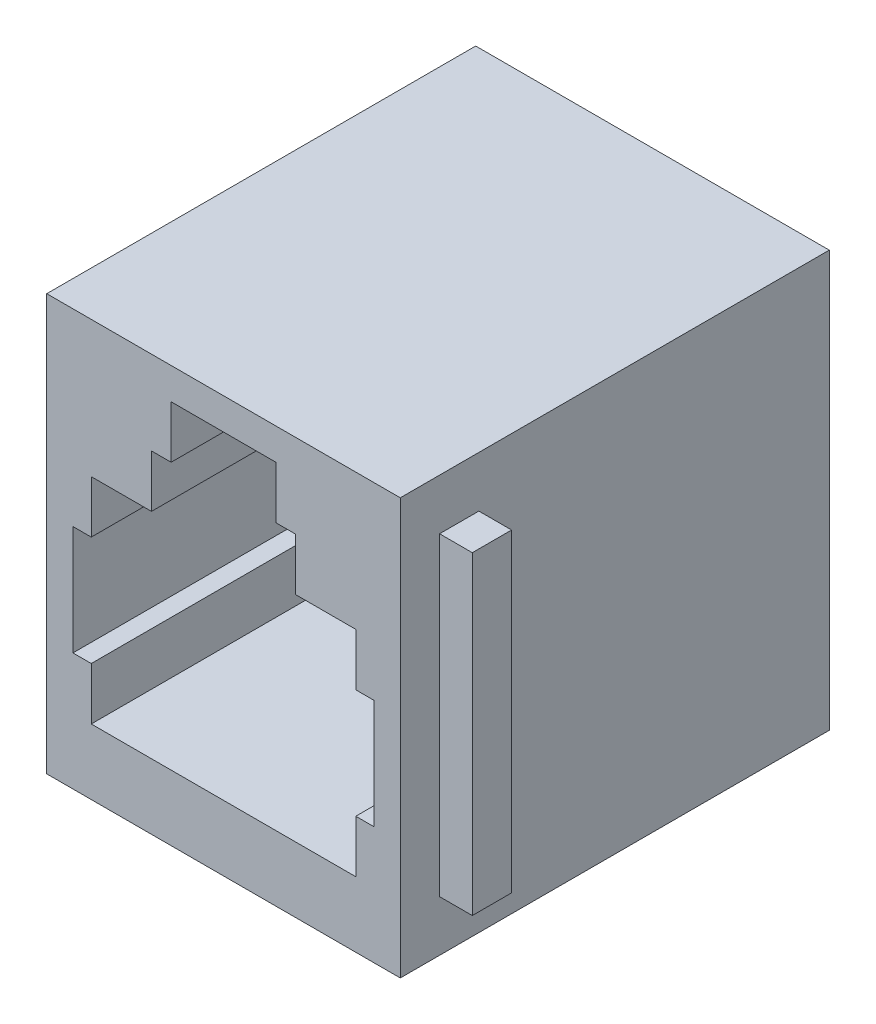
ISO-10303-21;
HEADER;
FILE_DESCRIPTION(('STEP AP214'),'2;1');
FILE_NAME('part.step','',(''),(''),'','','');
FILE_SCHEMA(('AUTOMOTIVE_DESIGN { 1 0 10303 214 1 1 1 1 }'));
ENDSEC;
DATA;
#1=APPLICATION_CONTEXT('core data for automotive mechanical design processes');
#2=APPLICATION_PROTOCOL_DEFINITION('international standard','automotive_design',2000,#1);
#3=PRODUCT_CONTEXT('',#1,'mechanical');
#4=PRODUCT('Part','Part','',(#3));
#5=PRODUCT_RELATED_PRODUCT_CATEGORY('part','',(#4));
#6=PRODUCT_DEFINITION_FORMATION('','',#4);
#7=PRODUCT_DEFINITION_CONTEXT('part definition',#1,'design');
#8=PRODUCT_DEFINITION('design','',#6,#7);
#9=PRODUCT_DEFINITION_SHAPE('','',#8);
#10=(LENGTH_UNIT() NAMED_UNIT(*) SI_UNIT(.MILLI.,.METRE.));
#11=(NAMED_UNIT(*) PLANE_ANGLE_UNIT() SI_UNIT($,.RADIAN.));
#12=(NAMED_UNIT(*) SI_UNIT($,.STERADIAN.) SOLID_ANGLE_UNIT());
#13=UNCERTAINTY_MEASURE_WITH_UNIT(LENGTH_MEASURE(1.E-05),#10,'distance_accuracy_value','');
#14=(GEOMETRIC_REPRESENTATION_CONTEXT(3) GLOBAL_UNCERTAINTY_ASSIGNED_CONTEXT((#13)) GLOBAL_UNIT_ASSIGNED_CONTEXT((#10,
#11,#12)) REPRESENTATION_CONTEXT('',''));
#15=CARTESIAN_POINT('',(0.,0.,0.));
#16=DIRECTION('',(0.,0.,1.));
#17=DIRECTION('',(1.,0.,0.));
#18=AXIS2_PLACEMENT_3D('',#15,#16,#17);
#19=CARTESIAN_POINT('',(-6.75,7.94,16.38));
#20=DIRECTION('',(1.,0.,0.));
#21=DIRECTION('',(0.,1.,0.));
#22=AXIS2_PLACEMENT_3D('',#19,#20,#21);
#23=PLANE('',#22);
#24=DIRECTION('',(0.,-1.,0.));
#25=VECTOR('',#24,1.);
#26=CARTESIAN_POINT('',(-6.75,6.,13.38));
#27=LINE('',#26,#25);
#28=CARTESIAN_POINT('',(-6.75,6.,13.38));
#29=VERTEX_POINT('',#28);
#30=CARTESIAN_POINT('',(-6.75,-6.,13.38));
#31=VERTEX_POINT('',#30);
#32=EDGE_CURVE('E49',#29,#31,#27,.T.);
#33=ORIENTED_EDGE('',*,*,#32,.F.);
#34=DIRECTION('',(0.,0.,-1.));
#35=VECTOR('',#34,1.);
#36=CARTESIAN_POINT('',(-6.75,6.,13.38));
#37=LINE('',#36,#35);
#38=CARTESIAN_POINT('',(-6.75,6.,14.88));
#39=VERTEX_POINT('',#38);
#40=EDGE_CURVE('E53',#39,#29,#37,.T.);
#41=ORIENTED_EDGE('',*,*,#40,.F.);
#42=DIRECTION('',(0.,-1.,0.));
#43=VECTOR('',#42,1.);
#44=CARTESIAN_POINT('',(-6.75,6.,14.88));
#45=LINE('',#44,#43);
#46=CARTESIAN_POINT('',(-6.75,-6.,14.88));
#47=VERTEX_POINT('',#46);
#48=EDGE_CURVE('E266',#39,#47,#45,.T.);
#49=ORIENTED_EDGE('',*,*,#48,.T.);
#50=DIRECTION('',(0.,0.,-1.));
#51=VECTOR('',#50,1.);
#52=CARTESIAN_POINT('',(-6.75,-6.,13.38));
#53=LINE('',#52,#51);
#54=EDGE_CURVE('E257',#47,#31,#53,.T.);
#55=ORIENTED_EDGE('',*,*,#54,.T.);
#56=EDGE_LOOP('',(#33,#41,#49,#55));
#57=FACE_BOUND('',#56,.T.);
#58=DIRECTION('',(0.,-1.,0.));
#59=VECTOR('',#58,1.);
#60=CARTESIAN_POINT('',(-6.75,7.94,0.));
#61=LINE('',#60,#59);
#62=CARTESIAN_POINT('',(-6.75,7.94,0.));
#63=VERTEX_POINT('',#62);
#64=CARTESIAN_POINT('',(-6.75,-7.94,0.));
#65=VERTEX_POINT('',#64);
#66=EDGE_CURVE('E437',#63,#65,#61,.T.);
#67=ORIENTED_EDGE('',*,*,#66,.T.);
#68=DIRECTION('',(0.,0.,-1.));
#69=VECTOR('',#68,1.);
#70=CARTESIAN_POINT('',(-6.75,-7.94,16.38));
#71=LINE('',#70,#69);
#72=CARTESIAN_POINT('',(-6.75,-7.94,16.38));
#73=VERTEX_POINT('',#72);
#74=EDGE_CURVE('E12',#73,#65,#71,.T.);
#75=ORIENTED_EDGE('',*,*,#74,.F.);
#76=DIRECTION('',(0.,-1.,0.));
#77=VECTOR('',#76,1.);
#78=CARTESIAN_POINT('',(-6.75,7.94,16.38));
#79=LINE('',#78,#77);
#80=CARTESIAN_POINT('',(-6.75,7.94,16.38));
#81=VERTEX_POINT('',#80);
#82=EDGE_CURVE('E438',#81,#73,#79,.T.);
#83=ORIENTED_EDGE('',*,*,#82,.F.);
#84=DIRECTION('',(0.,0.,-1.));
#85=VECTOR('',#84,1.);
#86=CARTESIAN_POINT('',(-6.75,7.94,16.38));
#87=LINE('',#86,#85);
#88=EDGE_CURVE('E448',#81,#63,#87,.T.);
#89=ORIENTED_EDGE('',*,*,#88,.T.);
#90=EDGE_LOOP('',(#67,#75,#83,#89));
#91=FACE_BOUND('',#90,.T.);
#92=ADVANCED_FACE('F35',(#57,#91),#23,.F.);
#93=CARTESIAN_POINT('',(-6.75,-7.94,16.38));
#94=DIRECTION('',(0.,1.,0.));
#95=DIRECTION('',(-1.,0.,0.));
#96=AXIS2_PLACEMENT_3D('',#93,#94,#95);
#97=PLANE('',#96);
#98=DIRECTION('',(1.,0.,0.));
#99=VECTOR('',#98,1.);
#100=CARTESIAN_POINT('',(-6.75,-7.94,0.));
#101=LINE('',#100,#99);
#102=CARTESIAN_POINT('',(6.75,-7.94,0.));
#103=VERTEX_POINT('',#102);
#104=EDGE_CURVE('E451',#65,#103,#101,.T.);
#105=ORIENTED_EDGE('',*,*,#104,.T.);
#106=DIRECTION('',(0.,0.,-1.));
#107=VECTOR('',#106,1.);
#108=CARTESIAN_POINT('',(6.75,-7.94,16.38));
#109=LINE('',#108,#107);
#110=CARTESIAN_POINT('',(6.75,-7.94,16.38));
#111=VERTEX_POINT('',#110);
#112=EDGE_CURVE('E42',#111,#103,#109,.T.);
#113=ORIENTED_EDGE('',*,*,#112,.F.);
#114=DIRECTION('',(1.,0.,0.));
#115=VECTOR('',#114,1.);
#116=CARTESIAN_POINT('',(-6.75,-7.94,16.38));
#117=LINE('',#116,#115);
#118=EDGE_CURVE('E441',#73,#111,#117,.T.);
#119=ORIENTED_EDGE('',*,*,#118,.F.);
#120=ORIENTED_EDGE('',*,*,#74,.T.);
#121=EDGE_LOOP('',(#105,#113,#119,#120));
#122=FACE_BOUND('',#121,.T.);
#123=ADVANCED_FACE('F481',(#122),#97,.F.);
#124=CARTESIAN_POINT('',(6.75,7.94,16.38));
#125=DIRECTION('',(-1.,0.,0.));
#126=DIRECTION('',(0.,-1.,0.));
#127=AXIS2_PLACEMENT_3D('',#124,#125,#126);
#128=PLANE('',#127);
#129=DIRECTION('',(0.,-1.,0.));
#130=VECTOR('',#129,1.);
#131=CARTESIAN_POINT('',(6.75,6.,14.88));
#132=LINE('',#131,#130);
#133=CARTESIAN_POINT('',(6.75,6.,14.88));
#134=VERTEX_POINT('',#133);
#135=CARTESIAN_POINT('',(6.75,-6.,14.88));
#136=VERTEX_POINT('',#135);
#137=EDGE_CURVE('E294',#134,#136,#132,.T.);
#138=ORIENTED_EDGE('',*,*,#137,.F.);
#139=DIRECTION('',(0.,0.,1.));
#140=VECTOR('',#139,1.);
#141=CARTESIAN_POINT('',(6.75,6.,13.38));
#142=LINE('',#141,#140);
#143=CARTESIAN_POINT('',(6.75,6.,13.38));
#144=VERTEX_POINT('',#143);
#145=EDGE_CURVE('E270',#144,#134,#142,.T.);
#146=ORIENTED_EDGE('',*,*,#145,.F.);
#147=DIRECTION('',(0.,-1.,0.));
#148=VECTOR('',#147,1.);
#149=CARTESIAN_POINT('',(6.75,6.,13.38));
#150=LINE('',#149,#148);
#151=CARTESIAN_POINT('',(6.75,-6.,13.38));
#152=VERTEX_POINT('',#151);
#153=EDGE_CURVE('E280',#144,#152,#150,.T.);
#154=ORIENTED_EDGE('',*,*,#153,.T.);
#155=DIRECTION('',(0.,0.,1.));
#156=VECTOR('',#155,1.);
#157=CARTESIAN_POINT('',(6.75,-6.,13.38));
#158=LINE('',#157,#156);
#159=EDGE_CURVE('E262',#152,#136,#158,.T.);
#160=ORIENTED_EDGE('',*,*,#159,.T.);
#161=EDGE_LOOP('',(#138,#146,#154,#160));
#162=FACE_BOUND('',#161,.T.);
#163=DIRECTION('',(0.,1.,0.));
#164=VECTOR('',#163,1.);
#165=CARTESIAN_POINT('',(6.75,7.94,0.));
#166=LINE('',#165,#164);
#167=CARTESIAN_POINT('',(6.75,7.94,0.));
#168=VERTEX_POINT('',#167);
#169=EDGE_CURVE('E453',#103,#168,#166,.T.);
#170=ORIENTED_EDGE('',*,*,#169,.T.);
#171=DIRECTION('',(0.,0.,-1.));
#172=VECTOR('',#171,1.);
#173=CARTESIAN_POINT('',(6.75,7.94,16.38));
#174=LINE('',#173,#172);
#175=CARTESIAN_POINT('',(6.75,7.94,16.38));
#176=VERTEX_POINT('',#175);
#177=EDGE_CURVE('E458',#176,#168,#174,.T.);
#178=ORIENTED_EDGE('',*,*,#177,.F.);
#179=DIRECTION('',(0.,1.,0.));
#180=VECTOR('',#179,1.);
#181=CARTESIAN_POINT('',(6.75,7.94,16.38));
#182=LINE('',#181,#180);
#183=EDGE_CURVE('E444',#111,#176,#182,.T.);
#184=ORIENTED_EDGE('',*,*,#183,.F.);
#185=ORIENTED_EDGE('',*,*,#112,.T.);
#186=EDGE_LOOP('',(#170,#178,#184,#185));
#187=FACE_BOUND('',#186,.T.);
#188=ADVANCED_FACE('F465',(#162,#187),#128,.F.);
#189=CARTESIAN_POINT('',(-6.75,7.94,16.38));
#190=DIRECTION('',(0.,-1.,0.));
#191=DIRECTION('',(1.,0.,0.));
#192=AXIS2_PLACEMENT_3D('',#189,#190,#191);
#193=PLANE('',#192);
#194=DIRECTION('',(-1.,0.,0.));
#195=VECTOR('',#194,1.);
#196=CARTESIAN_POINT('',(-6.75,7.94,0.));
#197=LINE('',#196,#195);
#198=EDGE_CURVE('E442',#168,#63,#197,.T.);
#199=ORIENTED_EDGE('',*,*,#198,.T.);
#200=ORIENTED_EDGE('',*,*,#88,.F.);
#201=DIRECTION('',(-1.,0.,0.));
#202=VECTOR('',#201,1.);
#203=CARTESIAN_POINT('',(-6.75,7.94,16.38));
#204=LINE('',#203,#202);
#205=EDGE_CURVE('E446',#176,#81,#204,.T.);
#206=ORIENTED_EDGE('',*,*,#205,.F.);
#207=ORIENTED_EDGE('',*,*,#177,.T.);
#208=EDGE_LOOP('',(#199,#200,#206,#207));
#209=FACE_BOUND('',#208,.T.);
#210=ADVANCED_FACE('F474',(#209),#193,.F.);
#211=CARTESIAN_POINT('',(0.,0.,16.38));
#212=DIRECTION('',(0.,0.,1.));
#213=DIRECTION('',(1.,0.,0.));
#214=AXIS2_PLACEMENT_3D('',#211,#212,#213);
#215=PLANE('',#214);
#216=DIRECTION('',(0.,1.,0.));
#217=VECTOR('',#216,1.);
#218=CARTESIAN_POINT('',(5.05,2.74,16.38));
#219=LINE('',#218,#217);
#220=CARTESIAN_POINT('',(5.05,0.740000000000001,16.38));
#221=VERTEX_POINT('',#220);
#222=CARTESIAN_POINT('',(5.05,2.74,16.38));
#223=VERTEX_POINT('',#222);
#224=EDGE_CURVE('E297',#221,#223,#219,.T.);
#225=ORIENTED_EDGE('',*,*,#224,.F.);
#226=DIRECTION('',(-1.,0.,0.));
#227=VECTOR('',#226,1.);
#228=CARTESIAN_POINT('',(5.05,0.740000000000001,16.38));
#229=LINE('',#228,#227);
#230=CARTESIAN_POINT('',(5.75,0.740000000000001,16.38));
#231=VERTEX_POINT('',#230);
#232=EDGE_CURVE('E393',#231,#221,#229,.T.);
#233=ORIENTED_EDGE('',*,*,#232,.F.);
#234=DIRECTION('',(0.,1.,0.));
#235=VECTOR('',#234,1.);
#236=CARTESIAN_POINT('',(5.75,0.740000000000001,16.38));
#237=LINE('',#236,#235);
#238=CARTESIAN_POINT('',(5.75,-3.44,16.38));
#239=VERTEX_POINT('',#238);
#240=EDGE_CURVE('E390',#239,#231,#237,.T.);
#241=ORIENTED_EDGE('',*,*,#240,.F.);
#242=DIRECTION('',(1.,0.,0.));
#243=VECTOR('',#242,1.);
#244=CARTESIAN_POINT('',(5.75,-3.44,16.38));
#245=LINE('',#244,#243);
#246=CARTESIAN_POINT('',(5.05,-3.44,16.38));
#247=VERTEX_POINT('',#246);
#248=EDGE_CURVE('E387',#247,#239,#245,.T.);
#249=ORIENTED_EDGE('',*,*,#248,.F.);
#250=DIRECTION('',(0.,1.,0.));
#251=VECTOR('',#250,1.);
#252=CARTESIAN_POINT('',(5.05,-3.44,16.38));
#253=LINE('',#252,#251);
#254=CARTESIAN_POINT('',(5.05,-5.44,16.38));
#255=VERTEX_POINT('',#254);
#256=EDGE_CURVE('E384',#255,#247,#253,.T.);
#257=ORIENTED_EDGE('',*,*,#256,.F.);
#258=DIRECTION('',(1.,0.,0.));
#259=VECTOR('',#258,1.);
#260=CARTESIAN_POINT('',(5.05,-5.44,16.38));
#261=LINE('',#260,#259);
#262=CARTESIAN_POINT('',(-5.05,-5.44,16.38));
#263=VERTEX_POINT('',#262);
#264=EDGE_CURVE('E381',#263,#255,#261,.T.);
#265=ORIENTED_EDGE('',*,*,#264,.F.);
#266=DIRECTION('',(0.,-1.,0.));
#267=VECTOR('',#266,1.);
#268=CARTESIAN_POINT('',(-5.05,-3.44,16.38));
#269=LINE('',#268,#267);
#270=CARTESIAN_POINT('',(-5.05,-3.44,16.38));
#271=VERTEX_POINT('',#270);
#272=EDGE_CURVE('E378',#271,#263,#269,.T.);
#273=ORIENTED_EDGE('',*,*,#272,.F.);
#274=DIRECTION('',(1.,0.,0.));
#275=VECTOR('',#274,1.);
#276=CARTESIAN_POINT('',(-5.75,-3.44,16.38));
#277=LINE('',#276,#275);
#278=CARTESIAN_POINT('',(-5.75,-3.44,16.38));
#279=VERTEX_POINT('',#278);
#280=EDGE_CURVE('E375',#279,#271,#277,.T.);
#281=ORIENTED_EDGE('',*,*,#280,.F.);
#282=DIRECTION('',(0.,-1.,0.));
#283=VECTOR('',#282,1.);
#284=CARTESIAN_POINT('',(-5.75,0.740000000000001,16.38));
#285=LINE('',#284,#283);
#286=CARTESIAN_POINT('',(-5.75,0.740000000000001,16.38));
#287=VERTEX_POINT('',#286);
#288=EDGE_CURVE('E372',#287,#279,#285,.T.);
#289=ORIENTED_EDGE('',*,*,#288,.F.);
#290=DIRECTION('',(-1.,0.,0.));
#291=VECTOR('',#290,1.);
#292=CARTESIAN_POINT('',(-5.05,0.740000000000001,16.38));
#293=LINE('',#292,#291);
#294=CARTESIAN_POINT('',(-5.05,0.740000000000001,16.38));
#295=VERTEX_POINT('',#294);
#296=EDGE_CURVE('E369',#295,#287,#293,.T.);
#297=ORIENTED_EDGE('',*,*,#296,.F.);
#298=DIRECTION('',(0.,-1.,0.));
#299=VECTOR('',#298,1.);
#300=CARTESIAN_POINT('',(-5.05,2.74,16.38));
#301=LINE('',#300,#299);
#302=CARTESIAN_POINT('',(-5.05,2.74,16.38));
#303=VERTEX_POINT('',#302);
#304=EDGE_CURVE('E366',#303,#295,#301,.T.);
#305=ORIENTED_EDGE('',*,*,#304,.F.);
#306=DIRECTION('',(-1.,0.,0.));
#307=VECTOR('',#306,1.);
#308=CARTESIAN_POINT('',(-2.75,2.74,16.38));
#309=LINE('',#308,#307);
#310=CARTESIAN_POINT('',(-2.75,2.74,16.38));
#311=VERTEX_POINT('',#310);
#312=EDGE_CURVE('E363',#311,#303,#309,.T.);
#313=ORIENTED_EDGE('',*,*,#312,.F.);
#314=DIRECTION('',(0.,-1.,0.));
#315=VECTOR('',#314,1.);
#316=CARTESIAN_POINT('',(-2.75,4.74,16.38));
#317=LINE('',#316,#315);
#318=CARTESIAN_POINT('',(-2.75,4.74,16.38));
#319=VERTEX_POINT('',#318);
#320=EDGE_CURVE('E360',#319,#311,#317,.T.);
#321=ORIENTED_EDGE('',*,*,#320,.F.);
#322=DIRECTION('',(-1.,0.,0.));
#323=VECTOR('',#322,1.);
#324=CARTESIAN_POINT('',(-2.,4.74,16.38));
#325=LINE('',#324,#323);
#326=CARTESIAN_POINT('',(-2.,4.74,16.38));
#327=VERTEX_POINT('',#326);
#328=EDGE_CURVE('E357',#327,#319,#325,.T.);
#329=ORIENTED_EDGE('',*,*,#328,.F.);
#330=DIRECTION('',(0.,-1.,0.));
#331=VECTOR('',#330,1.);
#332=CARTESIAN_POINT('',(-2.,6.74,16.38));
#333=LINE('',#332,#331);
#334=CARTESIAN_POINT('',(-2.,6.74,16.38));
#335=VERTEX_POINT('',#334);
#336=EDGE_CURVE('E354',#335,#327,#333,.T.);
#337=ORIENTED_EDGE('',*,*,#336,.F.);
#338=DIRECTION('',(-1.,0.,0.));
#339=VECTOR('',#338,1.);
#340=CARTESIAN_POINT('',(-2.,6.74,16.38));
#341=LINE('',#340,#339);
#342=CARTESIAN_POINT('',(2.,6.74,16.38));
#343=VERTEX_POINT('',#342);
#344=EDGE_CURVE('E351',#343,#335,#341,.T.);
#345=ORIENTED_EDGE('',*,*,#344,.F.);
#346=DIRECTION('',(0.,1.,0.));
#347=VECTOR('',#346,1.);
#348=CARTESIAN_POINT('',(2.,6.74,16.38));
#349=LINE('',#348,#347);
#350=CARTESIAN_POINT('',(2.,4.74,16.38));
#351=VERTEX_POINT('',#350);
#352=EDGE_CURVE('E348',#351,#343,#349,.T.);
#353=ORIENTED_EDGE('',*,*,#352,.F.);
#354=DIRECTION('',(-1.,0.,0.));
#355=VECTOR('',#354,1.);
#356=CARTESIAN_POINT('',(2.,4.74,16.38));
#357=LINE('',#356,#355);
#358=CARTESIAN_POINT('',(2.75,4.74,16.38));
#359=VERTEX_POINT('',#358);
#360=EDGE_CURVE('E345',#359,#351,#357,.T.);
#361=ORIENTED_EDGE('',*,*,#360,.F.);
#362=DIRECTION('',(0.,1.,0.));
#363=VECTOR('',#362,1.);
#364=CARTESIAN_POINT('',(2.75,4.74,16.38));
#365=LINE('',#364,#363);
#366=CARTESIAN_POINT('',(2.75,2.74,16.38));
#367=VERTEX_POINT('',#366);
#368=EDGE_CURVE('E342',#367,#359,#365,.T.);
#369=ORIENTED_EDGE('',*,*,#368,.F.);
#370=DIRECTION('',(-1.,0.,0.));
#371=VECTOR('',#370,1.);
#372=CARTESIAN_POINT('',(2.75,2.74,16.38));
#373=LINE('',#372,#371);
#374=EDGE_CURVE('E339',#223,#367,#373,.T.);
#375=ORIENTED_EDGE('',*,*,#374,.F.);
#376=EDGE_LOOP('',(#225,#233,#241,#249,#257,#265,#273,#281,#289,#297,#305,#313,#321,#329,#337,
#345,#353,#361,#369,#375));
#377=FACE_BOUND('',#376,.T.);
#378=ORIENTED_EDGE('',*,*,#82,.T.);
#379=ORIENTED_EDGE('',*,*,#118,.T.);
#380=ORIENTED_EDGE('',*,*,#183,.T.);
#381=ORIENTED_EDGE('',*,*,#205,.T.);
#382=EDGE_LOOP('',(#378,#379,#380,#381));
#383=FACE_BOUND('',#382,.T.);
#384=ADVANCED_FACE('F480',(#377,#383),#215,.T.);
#385=CARTESIAN_POINT('',(0.,0.,0.));
#386=DIRECTION('',(0.,0.,1.));
#387=DIRECTION('',(1.,0.,0.));
#388=AXIS2_PLACEMENT_3D('',#385,#386,#387);
#389=PLANE('',#388);
#390=ORIENTED_EDGE('',*,*,#66,.F.);
#391=ORIENTED_EDGE('',*,*,#198,.F.);
#392=ORIENTED_EDGE('',*,*,#169,.F.);
#393=ORIENTED_EDGE('',*,*,#104,.F.);
#394=EDGE_LOOP('',(#390,#391,#392,#393));
#395=FACE_BOUND('',#394,.T.);
#396=ADVANCED_FACE('F471',(#395),#389,.F.);
#397=CARTESIAN_POINT('',(5.05,2.74,-16.7511910024332));
#398=DIRECTION('',(1.,0.,0.));
#399=DIRECTION('',(0.,0.,-1.));
#400=AXIS2_PLACEMENT_3D('',#397,#398,#399);
#401=PLANE('',#400);
#402=DIRECTION('',(0.,-1.,0.));
#403=VECTOR('',#402,1.);
#404=CARTESIAN_POINT('',(5.05,2.74,1.));
#405=LINE('',#404,#403);
#406=CARTESIAN_POINT('',(5.05,2.74,1.));
#407=VERTEX_POINT('',#406);
#408=CARTESIAN_POINT('',(5.05,0.740000000000001,1.));
#409=VERTEX_POINT('',#408);
#410=EDGE_CURVE('E335',#407,#409,#405,.T.);
#411=ORIENTED_EDGE('',*,*,#410,.T.);
#412=DIRECTION('',(0.,0.,1.));
#413=VECTOR('',#412,1.);
#414=CARTESIAN_POINT('',(5.05,0.740000000000001,-16.7511910024332));
#415=LINE('',#414,#413);
#416=EDGE_CURVE('E301',#409,#221,#415,.T.);
#417=ORIENTED_EDGE('',*,*,#416,.T.);
#418=ORIENTED_EDGE('',*,*,#224,.T.);
#419=DIRECTION('',(0.,0.,1.));
#420=VECTOR('',#419,1.);
#421=CARTESIAN_POINT('',(5.05,2.74,-16.7511910024332));
#422=LINE('',#421,#420);
#423=EDGE_CURVE('E396',#407,#223,#422,.T.);
#424=ORIENTED_EDGE('',*,*,#423,.F.);
#425=EDGE_LOOP('',(#411,#417,#418,#424));
#426=FACE_BOUND('',#425,.T.);
#427=ADVANCED_FACE('F494',(#426),#401,.F.);
#428=CARTESIAN_POINT('',(5.05,0.740000000000001,-16.7511910024332));
#429=DIRECTION('',(0.,1.,0.));
#430=DIRECTION('',(-1.,0.,0.));
#431=AXIS2_PLACEMENT_3D('',#428,#429,#430);
#432=PLANE('',#431);
#433=DIRECTION('',(1.,0.,0.));
#434=VECTOR('',#433,1.);
#435=CARTESIAN_POINT('',(5.05,0.740000000000001,1.));
#436=LINE('',#435,#434);
#437=CARTESIAN_POINT('',(5.75,0.740000000000001,1.));
#438=VERTEX_POINT('',#437);
#439=EDGE_CURVE('E333',#409,#438,#436,.T.);
#440=ORIENTED_EDGE('',*,*,#439,.T.);
#441=DIRECTION('',(0.,0.,1.));
#442=VECTOR('',#441,1.);
#443=CARTESIAN_POINT('',(5.75,0.740000000000001,-16.7511910024332));
#444=LINE('',#443,#442);
#445=EDGE_CURVE('E398',#438,#231,#444,.T.);
#446=ORIENTED_EDGE('',*,*,#445,.T.);
#447=ORIENTED_EDGE('',*,*,#232,.T.);
#448=ORIENTED_EDGE('',*,*,#416,.F.);
#449=EDGE_LOOP('',(#440,#446,#447,#448));
#450=FACE_BOUND('',#449,.T.);
#451=ADVANCED_FACE('F500',(#450),#432,.F.);
#452=CARTESIAN_POINT('',(5.75,0.740000000000001,-16.7511910024332));
#453=DIRECTION('',(1.,0.,0.));
#454=DIRECTION('',(0.,1.,0.));
#455=AXIS2_PLACEMENT_3D('',#452,#453,#454);
#456=PLANE('',#455);
#457=DIRECTION('',(0.,-1.,0.));
#458=VECTOR('',#457,1.);
#459=CARTESIAN_POINT('',(5.75,0.740000000000001,1.));
#460=LINE('',#459,#458);
#461=CARTESIAN_POINT('',(5.75,-3.44,1.));
#462=VERTEX_POINT('',#461);
#463=EDGE_CURVE('E331',#438,#462,#460,.T.);
#464=ORIENTED_EDGE('',*,*,#463,.T.);
#465=DIRECTION('',(0.,0.,1.));
#466=VECTOR('',#465,1.);
#467=CARTESIAN_POINT('',(5.75,-3.44,-16.7511910024332));
#468=LINE('',#467,#466);
#469=EDGE_CURVE('E400',#462,#239,#468,.T.);
#470=ORIENTED_EDGE('',*,*,#469,.T.);
#471=ORIENTED_EDGE('',*,*,#240,.T.);
#472=ORIENTED_EDGE('',*,*,#445,.F.);
#473=EDGE_LOOP('',(#464,#470,#471,#472));
#474=FACE_BOUND('',#473,.T.);
#475=ADVANCED_FACE('F570',(#474),#456,.F.);
#476=CARTESIAN_POINT('',(5.75,-3.44,-16.7511910024332));
#477=DIRECTION('',(0.,-1.,0.));
#478=DIRECTION('',(0.,0.,-1.));
#479=AXIS2_PLACEMENT_3D('',#476,#477,#478);
#480=PLANE('',#479);
#481=DIRECTION('',(-1.,0.,0.));
#482=VECTOR('',#481,1.);
#483=CARTESIAN_POINT('',(5.75,-3.44,1.));
#484=LINE('',#483,#482);
#485=CARTESIAN_POINT('',(5.05,-3.44,1.));
#486=VERTEX_POINT('',#485);
#487=EDGE_CURVE('E329',#462,#486,#484,.T.);
#488=ORIENTED_EDGE('',*,*,#487,.T.);
#489=DIRECTION('',(0.,0.,1.));
#490=VECTOR('',#489,1.);
#491=CARTESIAN_POINT('',(5.05,-3.44,-16.7511910024332));
#492=LINE('',#491,#490);
#493=EDGE_CURVE('E402',#486,#247,#492,.T.);
#494=ORIENTED_EDGE('',*,*,#493,.T.);
#495=ORIENTED_EDGE('',*,*,#248,.T.);
#496=ORIENTED_EDGE('',*,*,#469,.F.);
#497=EDGE_LOOP('',(#488,#494,#495,#496));
#498=FACE_BOUND('',#497,.T.);
#499=ADVANCED_FACE('F566',(#498),#480,.F.);
#500=CARTESIAN_POINT('',(5.05,-3.44,-16.7511910024332));
#501=DIRECTION('',(1.,0.,0.));
#502=DIRECTION('',(0.,0.,-1.));
#503=AXIS2_PLACEMENT_3D('',#500,#501,#502);
#504=PLANE('',#503);
#505=DIRECTION('',(0.,-1.,0.));
#506=VECTOR('',#505,1.);
#507=CARTESIAN_POINT('',(5.05,-3.44,1.));
#508=LINE('',#507,#506);
#509=CARTESIAN_POINT('',(5.05,-5.44,1.));
#510=VERTEX_POINT('',#509);
#511=EDGE_CURVE('E327',#486,#510,#508,.T.);
#512=ORIENTED_EDGE('',*,*,#511,.T.);
#513=DIRECTION('',(0.,0.,1.));
#514=VECTOR('',#513,1.);
#515=CARTESIAN_POINT('',(5.05,-5.44,-16.7511910024332));
#516=LINE('',#515,#514);
#517=EDGE_CURVE('E404',#510,#255,#516,.T.);
#518=ORIENTED_EDGE('',*,*,#517,.T.);
#519=ORIENTED_EDGE('',*,*,#256,.T.);
#520=ORIENTED_EDGE('',*,*,#493,.F.);
#521=EDGE_LOOP('',(#512,#518,#519,#520));
#522=FACE_BOUND('',#521,.T.);
#523=ADVANCED_FACE('F562',(#522),#504,.F.);
#524=CARTESIAN_POINT('',(5.05,-5.44,-16.7511910024332));
#525=DIRECTION('',(0.,-1.,0.));
#526=DIRECTION('',(0.,0.,-1.));
#527=AXIS2_PLACEMENT_3D('',#524,#525,#526);
#528=PLANE('',#527);
#529=DIRECTION('',(-1.,0.,0.));
#530=VECTOR('',#529,1.);
#531=CARTESIAN_POINT('',(5.05,-5.44,1.));
#532=LINE('',#531,#530);
#533=CARTESIAN_POINT('',(-5.05,-5.44,1.));
#534=VERTEX_POINT('',#533);
#535=EDGE_CURVE('E325',#510,#534,#532,.T.);
#536=ORIENTED_EDGE('',*,*,#535,.T.);
#537=DIRECTION('',(0.,0.,1.));
#538=VECTOR('',#537,1.);
#539=CARTESIAN_POINT('',(-5.05,-5.44,-16.7511910024332));
#540=LINE('',#539,#538);
#541=EDGE_CURVE('E406',#534,#263,#540,.T.);
#542=ORIENTED_EDGE('',*,*,#541,.T.);
#543=ORIENTED_EDGE('',*,*,#264,.T.);
#544=ORIENTED_EDGE('',*,*,#517,.F.);
#545=EDGE_LOOP('',(#536,#542,#543,#544));
#546=FACE_BOUND('',#545,.T.);
#547=ADVANCED_FACE('F558',(#546),#528,.F.);
#548=CARTESIAN_POINT('',(-5.05,-3.44,-16.7511910024332));
#549=DIRECTION('',(-1.,0.,0.));
#550=DIRECTION('',(0.,0.,1.));
#551=AXIS2_PLACEMENT_3D('',#548,#549,#550);
#552=PLANE('',#551);
#553=DIRECTION('',(0.,1.,0.));
#554=VECTOR('',#553,1.);
#555=CARTESIAN_POINT('',(-5.05,-3.44,1.));
#556=LINE('',#555,#554);
#557=CARTESIAN_POINT('',(-5.05,-3.44,1.));
#558=VERTEX_POINT('',#557);
#559=EDGE_CURVE('E323',#534,#558,#556,.T.);
#560=ORIENTED_EDGE('',*,*,#559,.T.);
#561=DIRECTION('',(0.,0.,1.));
#562=VECTOR('',#561,1.);
#563=CARTESIAN_POINT('',(-5.05,-3.44,-16.7511910024332));
#564=LINE('',#563,#562);
#565=EDGE_CURVE('E408',#558,#271,#564,.T.);
#566=ORIENTED_EDGE('',*,*,#565,.T.);
#567=ORIENTED_EDGE('',*,*,#272,.T.);
#568=ORIENTED_EDGE('',*,*,#541,.F.);
#569=EDGE_LOOP('',(#560,#566,#567,#568));
#570=FACE_BOUND('',#569,.T.);
#571=ADVANCED_FACE('F554',(#570),#552,.F.);
#572=CARTESIAN_POINT('',(-5.75,-3.44,-16.7511910024332));
#573=DIRECTION('',(0.,-1.,0.));
#574=DIRECTION('',(0.,0.,-1.));
#575=AXIS2_PLACEMENT_3D('',#572,#573,#574);
#576=PLANE('',#575);
#577=DIRECTION('',(-1.,0.,0.));
#578=VECTOR('',#577,1.);
#579=CARTESIAN_POINT('',(-5.75,-3.44,1.));
#580=LINE('',#579,#578);
#581=CARTESIAN_POINT('',(-5.75,-3.44,1.));
#582=VERTEX_POINT('',#581);
#583=EDGE_CURVE('E321',#558,#582,#580,.T.);
#584=ORIENTED_EDGE('',*,*,#583,.T.);
#585=DIRECTION('',(0.,0.,1.));
#586=VECTOR('',#585,1.);
#587=CARTESIAN_POINT('',(-5.75,-3.44,-16.7511910024332));
#588=LINE('',#587,#586);
#589=EDGE_CURVE('E410',#582,#279,#588,.T.);
#590=ORIENTED_EDGE('',*,*,#589,.T.);
#591=ORIENTED_EDGE('',*,*,#280,.T.);
#592=ORIENTED_EDGE('',*,*,#565,.F.);
#593=EDGE_LOOP('',(#584,#590,#591,#592));
#594=FACE_BOUND('',#593,.T.);
#595=ADVANCED_FACE('F550',(#594),#576,.F.);
#596=CARTESIAN_POINT('',(-5.75,0.740000000000001,-16.7511910024332));
#597=DIRECTION('',(-1.,0.,0.));
#598=DIRECTION('',(0.,-1.,0.));
#599=AXIS2_PLACEMENT_3D('',#596,#597,#598);
#600=PLANE('',#599);
#601=DIRECTION('',(0.,1.,0.));
#602=VECTOR('',#601,1.);
#603=CARTESIAN_POINT('',(-5.75,0.740000000000001,1.));
#604=LINE('',#603,#602);
#605=CARTESIAN_POINT('',(-5.75,0.740000000000001,1.));
#606=VERTEX_POINT('',#605);
#607=EDGE_CURVE('E319',#582,#606,#604,.T.);
#608=ORIENTED_EDGE('',*,*,#607,.T.);
#609=DIRECTION('',(0.,0.,1.));
#610=VECTOR('',#609,1.);
#611=CARTESIAN_POINT('',(-5.75,0.740000000000001,-16.7511910024332));
#612=LINE('',#611,#610);
#613=EDGE_CURVE('E412',#606,#287,#612,.T.);
#614=ORIENTED_EDGE('',*,*,#613,.T.);
#615=ORIENTED_EDGE('',*,*,#288,.T.);
#616=ORIENTED_EDGE('',*,*,#589,.F.);
#617=EDGE_LOOP('',(#608,#614,#615,#616));
#618=FACE_BOUND('',#617,.T.);
#619=ADVANCED_FACE('F546',(#618),#600,.F.);
#620=CARTESIAN_POINT('',(-5.05,0.740000000000001,-16.7511910024332));
#621=DIRECTION('',(0.,1.,0.));
#622=DIRECTION('',(-1.,0.,0.));
#623=AXIS2_PLACEMENT_3D('',#620,#621,#622);
#624=PLANE('',#623);
#625=DIRECTION('',(1.,0.,0.));
#626=VECTOR('',#625,1.);
#627=CARTESIAN_POINT('',(-5.05,0.740000000000001,1.));
#628=LINE('',#627,#626);
#629=CARTESIAN_POINT('',(-5.05,0.740000000000001,1.));
#630=VERTEX_POINT('',#629);
#631=EDGE_CURVE('E317',#606,#630,#628,.T.);
#632=ORIENTED_EDGE('',*,*,#631,.T.);
#633=DIRECTION('',(0.,0.,1.));
#634=VECTOR('',#633,1.);
#635=CARTESIAN_POINT('',(-5.05,0.740000000000001,-16.7511910024332));
#636=LINE('',#635,#634);
#637=EDGE_CURVE('E414',#630,#295,#636,.T.);
#638=ORIENTED_EDGE('',*,*,#637,.T.);
#639=ORIENTED_EDGE('',*,*,#296,.T.);
#640=ORIENTED_EDGE('',*,*,#613,.F.);
#641=EDGE_LOOP('',(#632,#638,#639,#640));
#642=FACE_BOUND('',#641,.T.);
#643=ADVANCED_FACE('F542',(#642),#624,.F.);
#644=CARTESIAN_POINT('',(-5.05,2.74,-16.7511910024332));
#645=DIRECTION('',(-1.,0.,0.));
#646=DIRECTION('',(0.,0.,1.));
#647=AXIS2_PLACEMENT_3D('',#644,#645,#646);
#648=PLANE('',#647);
#649=DIRECTION('',(0.,1.,0.));
#650=VECTOR('',#649,1.);
#651=CARTESIAN_POINT('',(-5.05,2.74,1.));
#652=LINE('',#651,#650);
#653=CARTESIAN_POINT('',(-5.05,2.74,1.));
#654=VERTEX_POINT('',#653);
#655=EDGE_CURVE('E315',#630,#654,#652,.T.);
#656=ORIENTED_EDGE('',*,*,#655,.T.);
#657=DIRECTION('',(0.,0.,1.));
#658=VECTOR('',#657,1.);
#659=CARTESIAN_POINT('',(-5.05,2.74,-16.7511910024332));
#660=LINE('',#659,#658);
#661=EDGE_CURVE('E416',#654,#303,#660,.T.);
#662=ORIENTED_EDGE('',*,*,#661,.T.);
#663=ORIENTED_EDGE('',*,*,#304,.T.);
#664=ORIENTED_EDGE('',*,*,#637,.F.);
#665=EDGE_LOOP('',(#656,#662,#663,#664));
#666=FACE_BOUND('',#665,.T.);
#667=ADVANCED_FACE('F538',(#666),#648,.F.);
#668=CARTESIAN_POINT('',(-2.75,2.74,-16.7511910024332));
#669=DIRECTION('',(0.,1.,0.));
#670=DIRECTION('',(0.,0.,1.));
#671=AXIS2_PLACEMENT_3D('',#668,#669,#670);
#672=PLANE('',#671);
#673=DIRECTION('',(1.,0.,0.));
#674=VECTOR('',#673,1.);
#675=CARTESIAN_POINT('',(-2.75,2.74,1.));
#676=LINE('',#675,#674);
#677=CARTESIAN_POINT('',(-2.75,2.74,1.));
#678=VERTEX_POINT('',#677);
#679=EDGE_CURVE('E313',#654,#678,#676,.T.);
#680=ORIENTED_EDGE('',*,*,#679,.T.);
#681=DIRECTION('',(0.,0.,1.));
#682=VECTOR('',#681,1.);
#683=CARTESIAN_POINT('',(-2.75,2.74,-16.7511910024332));
#684=LINE('',#683,#682);
#685=EDGE_CURVE('E418',#678,#311,#684,.T.);
#686=ORIENTED_EDGE('',*,*,#685,.T.);
#687=ORIENTED_EDGE('',*,*,#312,.T.);
#688=ORIENTED_EDGE('',*,*,#661,.F.);
#689=EDGE_LOOP('',(#680,#686,#687,#688));
#690=FACE_BOUND('',#689,.T.);
#691=ADVANCED_FACE('F534',(#690),#672,.F.);
#692=CARTESIAN_POINT('',(-2.75,4.74,-16.7511910024332));
#693=DIRECTION('',(-1.,0.,0.));
#694=DIRECTION('',(0.,-1.,0.));
#695=AXIS2_PLACEMENT_3D('',#692,#693,#694);
#696=PLANE('',#695);
#697=DIRECTION('',(0.,1.,0.));
#698=VECTOR('',#697,1.);
#699=CARTESIAN_POINT('',(-2.75,4.74,1.));
#700=LINE('',#699,#698);
#701=CARTESIAN_POINT('',(-2.75,4.74,1.));
#702=VERTEX_POINT('',#701);
#703=EDGE_CURVE('E311',#678,#702,#700,.T.);
#704=ORIENTED_EDGE('',*,*,#703,.T.);
#705=DIRECTION('',(0.,0.,1.));
#706=VECTOR('',#705,1.);
#707=CARTESIAN_POINT('',(-2.75,4.74,-16.7511910024332));
#708=LINE('',#707,#706);
#709=EDGE_CURVE('E420',#702,#319,#708,.T.);
#710=ORIENTED_EDGE('',*,*,#709,.T.);
#711=ORIENTED_EDGE('',*,*,#320,.T.);
#712=ORIENTED_EDGE('',*,*,#685,.F.);
#713=EDGE_LOOP('',(#704,#710,#711,#712));
#714=FACE_BOUND('',#713,.T.);
#715=ADVANCED_FACE('F530',(#714),#696,.F.);
#716=CARTESIAN_POINT('',(-2.,4.74,-16.7511910024332));
#717=DIRECTION('',(0.,1.,0.));
#718=DIRECTION('',(0.,0.,1.));
#719=AXIS2_PLACEMENT_3D('',#716,#717,#718);
#720=PLANE('',#719);
#721=DIRECTION('',(1.,0.,0.));
#722=VECTOR('',#721,1.);
#723=CARTESIAN_POINT('',(-2.,4.74,1.));
#724=LINE('',#723,#722);
#725=CARTESIAN_POINT('',(-2.,4.74,1.));
#726=VERTEX_POINT('',#725);
#727=EDGE_CURVE('E309',#702,#726,#724,.T.);
#728=ORIENTED_EDGE('',*,*,#727,.T.);
#729=DIRECTION('',(0.,0.,1.));
#730=VECTOR('',#729,1.);
#731=CARTESIAN_POINT('',(-2.,4.74,-16.7511910024332));
#732=LINE('',#731,#730);
#733=EDGE_CURVE('E422',#726,#327,#732,.T.);
#734=ORIENTED_EDGE('',*,*,#733,.T.);
#735=ORIENTED_EDGE('',*,*,#328,.T.);
#736=ORIENTED_EDGE('',*,*,#709,.F.);
#737=EDGE_LOOP('',(#728,#734,#735,#736));
#738=FACE_BOUND('',#737,.T.);
#739=ADVANCED_FACE('F526',(#738),#720,.F.);
#740=CARTESIAN_POINT('',(-2.,6.74,-16.7511910024332));
#741=DIRECTION('',(-1.,0.,0.));
#742=DIRECTION('',(0.,-1.,0.));
#743=AXIS2_PLACEMENT_3D('',#740,#741,#742);
#744=PLANE('',#743);
#745=DIRECTION('',(0.,1.,0.));
#746=VECTOR('',#745,1.);
#747=CARTESIAN_POINT('',(-2.,6.74,1.));
#748=LINE('',#747,#746);
#749=CARTESIAN_POINT('',(-2.,6.74,1.));
#750=VERTEX_POINT('',#749);
#751=EDGE_CURVE('E307',#726,#750,#748,.T.);
#752=ORIENTED_EDGE('',*,*,#751,.T.);
#753=DIRECTION('',(0.,0.,1.));
#754=VECTOR('',#753,1.);
#755=CARTESIAN_POINT('',(-2.,6.74,-16.7511910024332));
#756=LINE('',#755,#754);
#757=EDGE_CURVE('E424',#750,#335,#756,.T.);
#758=ORIENTED_EDGE('',*,*,#757,.T.);
#759=ORIENTED_EDGE('',*,*,#336,.T.);
#760=ORIENTED_EDGE('',*,*,#733,.F.);
#761=EDGE_LOOP('',(#752,#758,#759,#760));
#762=FACE_BOUND('',#761,.T.);
#763=ADVANCED_FACE('F522',(#762),#744,.F.);
#764=CARTESIAN_POINT('',(-2.,6.74,-16.7511910024332));
#765=DIRECTION('',(0.,1.,0.));
#766=DIRECTION('',(0.,0.,1.));
#767=AXIS2_PLACEMENT_3D('',#764,#765,#766);
#768=PLANE('',#767);
#769=DIRECTION('',(1.,0.,0.));
#770=VECTOR('',#769,1.);
#771=CARTESIAN_POINT('',(-2.,6.74,1.));
#772=LINE('',#771,#770);
#773=CARTESIAN_POINT('',(2.,6.74,1.));
#774=VERTEX_POINT('',#773);
#775=EDGE_CURVE('E305',#750,#774,#772,.T.);
#776=ORIENTED_EDGE('',*,*,#775,.T.);
#777=DIRECTION('',(0.,0.,1.));
#778=VECTOR('',#777,1.);
#779=CARTESIAN_POINT('',(2.,6.74,-16.7511910024332));
#780=LINE('',#779,#778);
#781=EDGE_CURVE('E426',#774,#343,#780,.T.);
#782=ORIENTED_EDGE('',*,*,#781,.T.);
#783=ORIENTED_EDGE('',*,*,#344,.T.);
#784=ORIENTED_EDGE('',*,*,#757,.F.);
#785=EDGE_LOOP('',(#776,#782,#783,#784));
#786=FACE_BOUND('',#785,.T.);
#787=ADVANCED_FACE('F518',(#786),#768,.F.);
#788=CARTESIAN_POINT('',(2.,6.74,-16.7511910024332));
#789=DIRECTION('',(1.,0.,0.));
#790=DIRECTION('',(0.,1.,0.));
#791=AXIS2_PLACEMENT_3D('',#788,#789,#790);
#792=PLANE('',#791);
#793=DIRECTION('',(0.,-1.,0.));
#794=VECTOR('',#793,1.);
#795=CARTESIAN_POINT('',(2.,6.74,1.));
#796=LINE('',#795,#794);
#797=CARTESIAN_POINT('',(2.,4.74,1.));
#798=VERTEX_POINT('',#797);
#799=EDGE_CURVE('E303',#774,#798,#796,.T.);
#800=ORIENTED_EDGE('',*,*,#799,.T.);
#801=DIRECTION('',(0.,0.,1.));
#802=VECTOR('',#801,1.);
#803=CARTESIAN_POINT('',(2.,4.74,-16.7511910024332));
#804=LINE('',#803,#802);
#805=EDGE_CURVE('E428',#798,#351,#804,.T.);
#806=ORIENTED_EDGE('',*,*,#805,.T.);
#807=ORIENTED_EDGE('',*,*,#352,.T.);
#808=ORIENTED_EDGE('',*,*,#781,.F.);
#809=EDGE_LOOP('',(#800,#806,#807,#808));
#810=FACE_BOUND('',#809,.T.);
#811=ADVANCED_FACE('F514',(#810),#792,.F.);
#812=CARTESIAN_POINT('',(2.,4.74,-16.7511910024332));
#813=DIRECTION('',(0.,1.,0.));
#814=DIRECTION('',(0.,0.,1.));
#815=AXIS2_PLACEMENT_3D('',#812,#813,#814);
#816=PLANE('',#815);
#817=DIRECTION('',(1.,0.,0.));
#818=VECTOR('',#817,1.);
#819=CARTESIAN_POINT('',(2.,4.74,1.));
#820=LINE('',#819,#818);
#821=CARTESIAN_POINT('',(2.75,4.74,1.));
#822=VERTEX_POINT('',#821);
#823=EDGE_CURVE('E300',#798,#822,#820,.T.);
#824=ORIENTED_EDGE('',*,*,#823,.T.);
#825=DIRECTION('',(0.,0.,1.));
#826=VECTOR('',#825,1.);
#827=CARTESIAN_POINT('',(2.75,4.74,-16.7511910024332));
#828=LINE('',#827,#826);
#829=EDGE_CURVE('E430',#822,#359,#828,.T.);
#830=ORIENTED_EDGE('',*,*,#829,.T.);
#831=ORIENTED_EDGE('',*,*,#360,.T.);
#832=ORIENTED_EDGE('',*,*,#805,.F.);
#833=EDGE_LOOP('',(#824,#830,#831,#832));
#834=FACE_BOUND('',#833,.T.);
#835=ADVANCED_FACE('F510',(#834),#816,.F.);
#836=CARTESIAN_POINT('',(2.75,4.74,-16.7511910024332));
#837=DIRECTION('',(1.,0.,0.));
#838=DIRECTION('',(0.,1.,0.));
#839=AXIS2_PLACEMENT_3D('',#836,#837,#838);
#840=PLANE('',#839);
#841=DIRECTION('',(0.,-1.,0.));
#842=VECTOR('',#841,1.);
#843=CARTESIAN_POINT('',(2.75,4.74,1.));
#844=LINE('',#843,#842);
#845=CARTESIAN_POINT('',(2.75,2.74,1.));
#846=VERTEX_POINT('',#845);
#847=EDGE_CURVE('E298',#822,#846,#844,.T.);
#848=ORIENTED_EDGE('',*,*,#847,.T.);
#849=DIRECTION('',(0.,0.,1.));
#850=VECTOR('',#849,1.);
#851=CARTESIAN_POINT('',(2.75,2.74,-16.7511910024332));
#852=LINE('',#851,#850);
#853=EDGE_CURVE('E432',#846,#367,#852,.T.);
#854=ORIENTED_EDGE('',*,*,#853,.T.);
#855=ORIENTED_EDGE('',*,*,#368,.T.);
#856=ORIENTED_EDGE('',*,*,#829,.F.);
#857=EDGE_LOOP('',(#848,#854,#855,#856));
#858=FACE_BOUND('',#857,.T.);
#859=ADVANCED_FACE('F506',(#858),#840,.F.);
#860=CARTESIAN_POINT('',(2.75,2.74,-16.7511910024332));
#861=DIRECTION('',(0.,1.,0.));
#862=DIRECTION('',(0.,0.,1.));
#863=AXIS2_PLACEMENT_3D('',#860,#861,#862);
#864=PLANE('',#863);
#865=DIRECTION('',(1.,0.,0.));
#866=VECTOR('',#865,1.);
#867=CARTESIAN_POINT('',(2.75,2.74,1.));
#868=LINE('',#867,#866);
#869=EDGE_CURVE('E337',#846,#407,#868,.T.);
#870=ORIENTED_EDGE('',*,*,#869,.T.);
#871=ORIENTED_EDGE('',*,*,#423,.T.);
#872=ORIENTED_EDGE('',*,*,#374,.T.);
#873=ORIENTED_EDGE('',*,*,#853,.F.);
#874=EDGE_LOOP('',(#870,#871,#872,#873));
#875=FACE_BOUND('',#874,.T.);
#876=ADVANCED_FACE('F502',(#875),#864,.F.);
#877=CARTESIAN_POINT('',(0.,0.,1.));
#878=DIRECTION('',(0.,0.,1.));
#879=DIRECTION('',(1.,0.,0.));
#880=AXIS2_PLACEMENT_3D('',#877,#878,#879);
#881=PLANE('',#880);
#882=ORIENTED_EDGE('',*,*,#410,.F.);
#883=ORIENTED_EDGE('',*,*,#869,.F.);
#884=ORIENTED_EDGE('',*,*,#847,.F.);
#885=ORIENTED_EDGE('',*,*,#823,.F.);
#886=ORIENTED_EDGE('',*,*,#799,.F.);
#887=ORIENTED_EDGE('',*,*,#775,.F.);
#888=ORIENTED_EDGE('',*,*,#751,.F.);
#889=ORIENTED_EDGE('',*,*,#727,.F.);
#890=ORIENTED_EDGE('',*,*,#703,.F.);
#891=ORIENTED_EDGE('',*,*,#679,.F.);
#892=ORIENTED_EDGE('',*,*,#655,.F.);
#893=ORIENTED_EDGE('',*,*,#631,.F.);
#894=ORIENTED_EDGE('',*,*,#607,.F.);
#895=ORIENTED_EDGE('',*,*,#583,.F.);
#896=ORIENTED_EDGE('',*,*,#559,.F.);
#897=ORIENTED_EDGE('',*,*,#535,.F.);
#898=ORIENTED_EDGE('',*,*,#511,.F.);
#899=ORIENTED_EDGE('',*,*,#487,.F.);
#900=ORIENTED_EDGE('',*,*,#463,.F.);
#901=ORIENTED_EDGE('',*,*,#439,.F.);
#902=EDGE_LOOP('',(#882,#883,#884,#885,#886,#887,#888,#889,#890,#891,#892,#893,#894,#895,#896,
#897,#898,#899,#900,#901));
#903=FACE_BOUND('',#902,.T.);
#904=ADVANCED_FACE('F505',(#903),#881,.T.);
#905=CARTESIAN_POINT('',(6.75,6.,14.88));
#906=DIRECTION('',(0.,0.,-1.));
#907=DIRECTION('',(-1.,0.,0.));
#908=AXIS2_PLACEMENT_3D('',#905,#906,#907);
#909=PLANE('',#908);
#910=DIRECTION('',(1.,0.,0.));
#911=VECTOR('',#910,1.);
#912=CARTESIAN_POINT('',(6.75,-6.,14.88));
#913=LINE('',#912,#911);
#914=CARTESIAN_POINT('',(8.,-6.,14.88));
#915=VERTEX_POINT('',#914);
#916=EDGE_CURVE('E264',#136,#915,#913,.T.);
#917=ORIENTED_EDGE('',*,*,#916,.T.);
#918=DIRECTION('',(0.,-1.,0.));
#919=VECTOR('',#918,1.);
#920=CARTESIAN_POINT('',(8.,6.,14.88));
#921=LINE('',#920,#919);
#922=CARTESIAN_POINT('',(8.,6.,14.88));
#923=VERTEX_POINT('',#922);
#924=EDGE_CURVE('E291',#923,#915,#921,.T.);
#925=ORIENTED_EDGE('',*,*,#924,.F.);
#926=DIRECTION('',(1.,0.,0.));
#927=VECTOR('',#926,1.);
#928=CARTESIAN_POINT('',(6.75,6.,14.88));
#929=LINE('',#928,#927);
#930=EDGE_CURVE('E273',#134,#923,#929,.T.);
#931=ORIENTED_EDGE('',*,*,#930,.F.);
#932=ORIENTED_EDGE('',*,*,#137,.T.);
#933=EDGE_LOOP('',(#917,#925,#931,#932));
#934=FACE_BOUND('',#933,.T.);
#935=ADVANCED_FACE('F580',(#934),#909,.F.);
#936=CARTESIAN_POINT('',(8.,6.,13.38));
#937=DIRECTION('',(-1.,0.,0.));
#938=DIRECTION('',(0.,0.,1.));
#939=AXIS2_PLACEMENT_3D('',#936,#937,#938);
#940=PLANE('',#939);
#941=DIRECTION('',(0.,0.,-1.));
#942=VECTOR('',#941,1.);
#943=CARTESIAN_POINT('',(8.,-6.,13.38));
#944=LINE('',#943,#942);
#945=CARTESIAN_POINT('',(8.,-6.,13.38));
#946=VERTEX_POINT('',#945);
#947=EDGE_CURVE('E283',#915,#946,#944,.T.);
#948=ORIENTED_EDGE('',*,*,#947,.T.);
#949=DIRECTION('',(0.,-1.,0.));
#950=VECTOR('',#949,1.);
#951=CARTESIAN_POINT('',(8.,6.,13.38));
#952=LINE('',#951,#950);
#953=CARTESIAN_POINT('',(8.,6.,13.38));
#954=VERTEX_POINT('',#953);
#955=EDGE_CURVE('E288',#954,#946,#952,.T.);
#956=ORIENTED_EDGE('',*,*,#955,.F.);
#957=DIRECTION('',(0.,0.,-1.));
#958=VECTOR('',#957,1.);
#959=CARTESIAN_POINT('',(8.,6.,13.38));
#960=LINE('',#959,#958);
#961=EDGE_CURVE('E276',#923,#954,#960,.T.);
#962=ORIENTED_EDGE('',*,*,#961,.F.);
#963=ORIENTED_EDGE('',*,*,#924,.T.);
#964=EDGE_LOOP('',(#948,#956,#962,#963));
#965=FACE_BOUND('',#964,.T.);
#966=ADVANCED_FACE('F584',(#965),#940,.F.);
#967=CARTESIAN_POINT('',(6.75,6.,13.38));
#968=DIRECTION('',(0.,0.,1.));
#969=DIRECTION('',(1.,0.,0.));
#970=AXIS2_PLACEMENT_3D('',#967,#968,#969);
#971=PLANE('',#970);
#972=DIRECTION('',(-1.,0.,0.));
#973=VECTOR('',#972,1.);
#974=CARTESIAN_POINT('',(6.75,-6.,13.38));
#975=LINE('',#974,#973);
#976=EDGE_CURVE('E274',#946,#152,#975,.T.);
#977=ORIENTED_EDGE('',*,*,#976,.T.);
#978=ORIENTED_EDGE('',*,*,#153,.F.);
#979=DIRECTION('',(-1.,0.,0.));
#980=VECTOR('',#979,1.);
#981=CARTESIAN_POINT('',(6.75,6.,13.38));
#982=LINE('',#981,#980);
#983=EDGE_CURVE('E278',#954,#144,#982,.T.);
#984=ORIENTED_EDGE('',*,*,#983,.F.);
#985=ORIENTED_EDGE('',*,*,#955,.T.);
#986=EDGE_LOOP('',(#977,#978,#984,#985));
#987=FACE_BOUND('',#986,.T.);
#988=ADVANCED_FACE('F588',(#987),#971,.F.);
#989=CARTESIAN_POINT('',(0.,6.,0.));
#990=DIRECTION('',(0.,1.,0.));
#991=DIRECTION('',(0.,0.,1.));
#992=AXIS2_PLACEMENT_3D('',#989,#990,#991);
#993=PLANE('',#992);
#994=ORIENTED_EDGE('',*,*,#145,.T.);
#995=ORIENTED_EDGE('',*,*,#930,.T.);
#996=ORIENTED_EDGE('',*,*,#961,.T.);
#997=ORIENTED_EDGE('',*,*,#983,.T.);
#998=EDGE_LOOP('',(#994,#995,#996,#997));
#999=FACE_BOUND('',#998,.T.);
#1000=ADVANCED_FACE('F592',(#999),#993,.T.);
#1001=CARTESIAN_POINT('',(0.,-6.,0.));
#1002=DIRECTION('',(0.,1.,0.));
#1003=DIRECTION('',(0.,0.,1.));
#1004=AXIS2_PLACEMENT_3D('',#1001,#1002,#1003);
#1005=PLANE('',#1004);
#1006=ORIENTED_EDGE('',*,*,#159,.F.);
#1007=ORIENTED_EDGE('',*,*,#976,.F.);
#1008=ORIENTED_EDGE('',*,*,#947,.F.);
#1009=ORIENTED_EDGE('',*,*,#916,.F.);
#1010=EDGE_LOOP('',(#1006,#1007,#1008,#1009));
#1011=FACE_BOUND('',#1010,.T.);
#1012=ADVANCED_FACE('F594',(#1011),#1005,.F.);
#1013=CARTESIAN_POINT('',(-6.75,6.,13.38));
#1014=DIRECTION('',(0.,0.,1.));
#1015=DIRECTION('',(1.,0.,0.));
#1016=AXIS2_PLACEMENT_3D('',#1013,#1014,#1015);
#1017=PLANE('',#1016);
#1018=DIRECTION('',(-1.,0.,0.));
#1019=VECTOR('',#1018,1.);
#1020=CARTESIAN_POINT('',(-6.75,-6.,13.38));
#1021=LINE('',#1020,#1019);
#1022=CARTESIAN_POINT('',(-8.,-6.,13.38));
#1023=VERTEX_POINT('',#1022);
#1024=EDGE_CURVE('E261',#31,#1023,#1021,.T.);
#1025=ORIENTED_EDGE('',*,*,#1024,.T.);
#1026=DIRECTION('',(0.,-1.,0.));
#1027=VECTOR('',#1026,1.);
#1028=CARTESIAN_POINT('',(-8.,6.,13.38));
#1029=LINE('',#1028,#1027);
#1030=CARTESIAN_POINT('',(-8.,6.,13.38));
#1031=VERTEX_POINT('',#1030);
#1032=EDGE_CURVE('E245',#1031,#1023,#1029,.T.);
#1033=ORIENTED_EDGE('',*,*,#1032,.F.);
#1034=DIRECTION('',(-1.,0.,0.));
#1035=VECTOR('',#1034,1.);
#1036=CARTESIAN_POINT('',(-6.75,6.,13.38));
#1037=LINE('',#1036,#1035);
#1038=EDGE_CURVE('E252',#29,#1031,#1037,.T.);
#1039=ORIENTED_EDGE('',*,*,#1038,.F.);
#1040=ORIENTED_EDGE('',*,*,#32,.T.);
#1041=EDGE_LOOP('',(#1025,#1033,#1039,#1040));
#1042=FACE_BOUND('',#1041,.T.);
#1043=ADVANCED_FACE('F259',(#1042),#1017,.F.);
#1044=CARTESIAN_POINT('',(-8.,6.,13.38));
#1045=DIRECTION('',(1.,0.,0.));
#1046=DIRECTION('',(0.,0.,-1.));
#1047=AXIS2_PLACEMENT_3D('',#1044,#1045,#1046);
#1048=PLANE('',#1047);
#1049=DIRECTION('',(0.,0.,1.));
#1050=VECTOR('',#1049,1.);
#1051=CARTESIAN_POINT('',(-8.,-6.,13.38));
#1052=LINE('',#1051,#1050);
#1053=CARTESIAN_POINT('',(-8.,-6.,14.88));
#1054=VERTEX_POINT('',#1053);
#1055=EDGE_CURVE('E836',#1023,#1054,#1052,.T.);
#1056=ORIENTED_EDGE('',*,*,#1055,.T.);
#1057=DIRECTION('',(0.,-1.,0.));
#1058=VECTOR('',#1057,1.);
#1059=CARTESIAN_POINT('',(-8.,6.,14.88));
#1060=LINE('',#1059,#1058);
#1061=CARTESIAN_POINT('',(-8.,6.,14.88));
#1062=VERTEX_POINT('',#1061);
#1063=EDGE_CURVE('E248',#1062,#1054,#1060,.T.);
#1064=ORIENTED_EDGE('',*,*,#1063,.F.);
#1065=DIRECTION('',(0.,0.,1.));
#1066=VECTOR('',#1065,1.);
#1067=CARTESIAN_POINT('',(-8.,6.,13.38));
#1068=LINE('',#1067,#1066);
#1069=EDGE_CURVE('E241',#1031,#1062,#1068,.T.);
#1070=ORIENTED_EDGE('',*,*,#1069,.F.);
#1071=ORIENTED_EDGE('',*,*,#1032,.T.);
#1072=EDGE_LOOP('',(#1056,#1064,#1070,#1071));
#1073=FACE_BOUND('',#1072,.T.);
#1074=ADVANCED_FACE('F243',(#1073),#1048,.F.);
#1075=CARTESIAN_POINT('',(-6.75,6.,14.88));
#1076=DIRECTION('',(0.,0.,-1.));
#1077=DIRECTION('',(-1.,0.,0.));
#1078=AXIS2_PLACEMENT_3D('',#1075,#1076,#1077);
#1079=PLANE('',#1078);
#1080=DIRECTION('',(1.,0.,0.));
#1081=VECTOR('',#1080,1.);
#1082=CARTESIAN_POINT('',(-6.75,-6.,14.88));
#1083=LINE('',#1082,#1081);
#1084=EDGE_CURVE('E838',#1054,#47,#1083,.T.);
#1085=ORIENTED_EDGE('',*,*,#1084,.T.);
#1086=ORIENTED_EDGE('',*,*,#48,.F.);
#1087=DIRECTION('',(1.,0.,0.));
#1088=VECTOR('',#1087,1.);
#1089=CARTESIAN_POINT('',(-6.75,6.,14.88));
#1090=LINE('',#1089,#1088);
#1091=EDGE_CURVE('E251',#1062,#39,#1090,.T.);
#1092=ORIENTED_EDGE('',*,*,#1091,.F.);
#1093=ORIENTED_EDGE('',*,*,#1063,.T.);
#1094=EDGE_LOOP('',(#1085,#1086,#1092,#1093));
#1095=FACE_BOUND('',#1094,.T.);
#1096=ADVANCED_FACE('F605',(#1095),#1079,.F.);
#1097=CARTESIAN_POINT('',(0.,6.,0.));
#1098=DIRECTION('',(0.,1.,0.));
#1099=DIRECTION('',(0.,0.,1.));
#1100=AXIS2_PLACEMENT_3D('',#1097,#1098,#1099);
#1101=PLANE('',#1100);
#1102=ORIENTED_EDGE('',*,*,#1038,.T.);
#1103=ORIENTED_EDGE('',*,*,#1069,.T.);
#1104=ORIENTED_EDGE('',*,*,#1091,.T.);
#1105=ORIENTED_EDGE('',*,*,#40,.T.);
#1106=EDGE_LOOP('',(#1102,#1103,#1104,#1105));
#1107=FACE_BOUND('',#1106,.T.);
#1108=ADVANCED_FACE('F255',(#1107),#1101,.T.);
#1109=CARTESIAN_POINT('',(0.,-6.,0.));
#1110=DIRECTION('',(0.,1.,0.));
#1111=DIRECTION('',(0.,0.,1.));
#1112=AXIS2_PLACEMENT_3D('',#1109,#1110,#1111);
#1113=PLANE('',#1112);
#1114=ORIENTED_EDGE('',*,*,#1024,.F.);
#1115=ORIENTED_EDGE('',*,*,#54,.F.);
#1116=ORIENTED_EDGE('',*,*,#1084,.F.);
#1117=ORIENTED_EDGE('',*,*,#1055,.F.);
#1118=EDGE_LOOP('',(#1114,#1115,#1116,#1117));
#1119=FACE_BOUND('',#1118,.T.);
#1120=ADVANCED_FACE('F609',(#1119),#1113,.F.);
#1121=CLOSED_SHELL('',(#92,#123,#188,#210,#384,#396,#427,#451,#475,#499,#523,#547,#571,#595,
#619,#643,#667,#691,#715,#739,#763,#787,#811,#835,#859,#876,#904,#935,#966,#988,#1000,#1012,
#1043,#1074,#1096,#1108,#1120));
#1122=MANIFOLD_SOLID_BREP('B2',#1121);
#1123=ADVANCED_BREP_SHAPE_REPRESENTATION('',(#18,#1122),#14);
#1124=SHAPE_DEFINITION_REPRESENTATION(#9,#1123);
ENDSEC;
END-ISO-10303-21;
